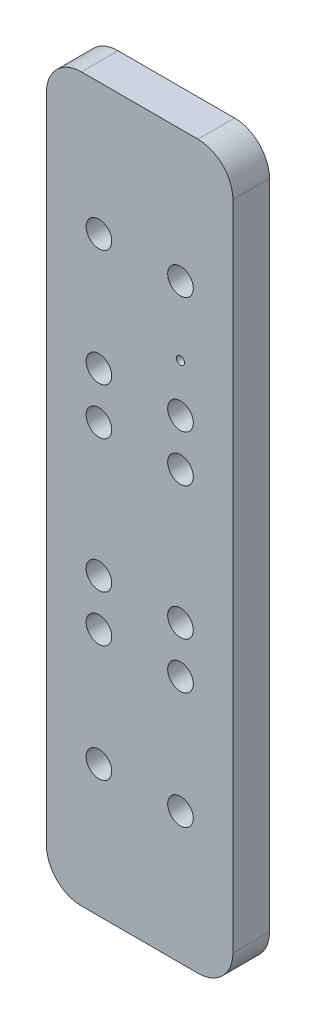
ISO-10303-21;
HEADER;
FILE_DESCRIPTION(('STEP AP214'),'2;1');
FILE_NAME('part.step','',(''),(''),'','','');
FILE_SCHEMA(('AUTOMOTIVE_DESIGN { 1 0 10303 214 1 1 1 1 }'));
ENDSEC;
DATA;
#1=APPLICATION_CONTEXT('core data for automotive mechanical design processes');
#2=APPLICATION_PROTOCOL_DEFINITION('international standard','automotive_design',2000,#1);
#3=PRODUCT_CONTEXT('',#1,'mechanical');
#4=PRODUCT('Part','Part','',(#3));
#5=PRODUCT_RELATED_PRODUCT_CATEGORY('part','',(#4));
#6=PRODUCT_DEFINITION_FORMATION('','',#4);
#7=PRODUCT_DEFINITION_CONTEXT('part definition',#1,'design');
#8=PRODUCT_DEFINITION('design','',#6,#7);
#9=PRODUCT_DEFINITION_SHAPE('','',#8);
#10=(LENGTH_UNIT() NAMED_UNIT(*) SI_UNIT(.MILLI.,.METRE.));
#11=(NAMED_UNIT(*) PLANE_ANGLE_UNIT() SI_UNIT($,.RADIAN.));
#12=(NAMED_UNIT(*) SI_UNIT($,.STERADIAN.) SOLID_ANGLE_UNIT());
#13=UNCERTAINTY_MEASURE_WITH_UNIT(LENGTH_MEASURE(1.E-05),#10,'distance_accuracy_value','');
#14=(GEOMETRIC_REPRESENTATION_CONTEXT(3) GLOBAL_UNCERTAINTY_ASSIGNED_CONTEXT((#13)) GLOBAL_UNIT_ASSIGNED_CONTEXT((#10,
#11,#12)) REPRESENTATION_CONTEXT('',''));
#15=CARTESIAN_POINT('',(0.,0.,0.));
#16=DIRECTION('',(0.,0.,1.));
#17=DIRECTION('',(1.,0.,0.));
#18=AXIS2_PLACEMENT_3D('',#15,#16,#17);
#19=CARTESIAN_POINT('',(4.,15.5,1.57));
#20=DIRECTION('',(0.,0.,1.));
#21=DIRECTION('',(1.,0.,0.));
#22=AXIS2_PLACEMENT_3D('',#19,#20,#21);
#23=PLANE('',#22);
#24=CARTESIAN_POINT('',(2.25,10.65,1.57));
#25=DIRECTION('',(0.,0.,1.));
#26=DIRECTION('',(1.,0.,0.));
#27=AXIS2_PLACEMENT_3D('',#24,#25,#26);
#28=CIRCLE('',#27,0.55);
#29=CARTESIAN_POINT('',(2.8,10.65,1.57));
#30=VERTEX_POINT('',#29);
#31=EDGE_CURVE('E165',#30,#30,#28,.F.);
#32=ORIENTED_EDGE('',*,*,#31,.T.);
#33=EDGE_LOOP('',(#32));
#34=FACE_BOUND('',#33,.T.);
#35=CARTESIAN_POINT('',(2.25,12.65,1.57));
#36=DIRECTION('',(0.,0.,1.));
#37=DIRECTION('',(1.,0.,0.));
#38=AXIS2_PLACEMENT_3D('',#35,#36,#37);
#39=CIRCLE('',#38,0.55);
#40=CARTESIAN_POINT('',(2.8,12.65,1.57));
#41=VERTEX_POINT('',#40);
#42=EDGE_CURVE('E168',#41,#41,#39,.F.);
#43=ORIENTED_EDGE('',*,*,#42,.T.);
#44=EDGE_LOOP('',(#43));
#45=FACE_BOUND('',#44,.T.);
#46=CARTESIAN_POINT('',(5.75,5.65,1.57));
#47=DIRECTION('',(0.,0.,1.));
#48=DIRECTION('',(1.,0.,0.));
#49=AXIS2_PLACEMENT_3D('',#46,#47,#48);
#50=CIRCLE('',#49,0.55);
#51=CARTESIAN_POINT('',(6.3,5.65,1.57));
#52=VERTEX_POINT('',#51);
#53=EDGE_CURVE('E171',#52,#52,#50,.F.);
#54=ORIENTED_EDGE('',*,*,#53,.T.);
#55=EDGE_LOOP('',(#54));
#56=FACE_BOUND('',#55,.T.);
#57=CARTESIAN_POINT('',(5.75,22.4,1.57));
#58=DIRECTION('',(0.,0.,1.));
#59=DIRECTION('',(1.,0.,0.));
#60=AXIS2_PLACEMENT_3D('',#57,#58,#59);
#61=CIRCLE('',#60,0.175000000000001);
#62=CARTESIAN_POINT('',(5.925,22.4,1.57));
#63=VERTEX_POINT('',#62);
#64=EDGE_CURVE('E174',#63,#63,#61,.F.);
#65=ORIENTED_EDGE('',*,*,#64,.T.);
#66=EDGE_LOOP('',(#65));
#67=FACE_BOUND('',#66,.T.);
#68=CARTESIAN_POINT('',(2.25,20.35,1.57));
#69=DIRECTION('',(0.,0.,1.));
#70=DIRECTION('',(1.,0.,0.));
#71=AXIS2_PLACEMENT_3D('',#68,#69,#70);
#72=CIRCLE('',#71,0.55);
#73=CARTESIAN_POINT('',(2.8,20.35,1.57));
#74=VERTEX_POINT('',#73);
#75=EDGE_CURVE('E177',#74,#74,#72,.F.);
#76=ORIENTED_EDGE('',*,*,#75,.T.);
#77=EDGE_LOOP('',(#76));
#78=FACE_BOUND('',#77,.T.);
#79=CARTESIAN_POINT('',(2.25,18.35,1.57));
#80=DIRECTION('',(0.,0.,1.));
#81=DIRECTION('',(1.,0.,0.));
#82=AXIS2_PLACEMENT_3D('',#79,#80,#81);
#83=CIRCLE('',#82,0.55);
#84=CARTESIAN_POINT('',(2.8,18.35,1.57));
#85=VERTEX_POINT('',#84);
#86=EDGE_CURVE('E180',#85,#85,#83,.F.);
#87=ORIENTED_EDGE('',*,*,#86,.T.);
#88=EDGE_LOOP('',(#87));
#89=FACE_BOUND('',#88,.T.);
#90=CARTESIAN_POINT('',(5.75,25.35,1.57));
#91=DIRECTION('',(0.,0.,1.));
#92=DIRECTION('',(1.,0.,0.));
#93=AXIS2_PLACEMENT_3D('',#90,#91,#92);
#94=CIRCLE('',#93,0.55);
#95=CARTESIAN_POINT('',(6.3,25.35,1.57));
#96=VERTEX_POINT('',#95);
#97=EDGE_CURVE('E183',#96,#96,#94,.F.);
#98=ORIENTED_EDGE('',*,*,#97,.T.);
#99=EDGE_LOOP('',(#98));
#100=FACE_BOUND('',#99,.T.);
#101=CARTESIAN_POINT('',(2.25,25.35,1.57));
#102=DIRECTION('',(0.,0.,1.));
#103=DIRECTION('',(1.,0.,0.));
#104=AXIS2_PLACEMENT_3D('',#101,#102,#103);
#105=CIRCLE('',#104,0.55);
#106=CARTESIAN_POINT('',(2.8,25.35,1.57));
#107=VERTEX_POINT('',#106);
#108=EDGE_CURVE('E186',#107,#107,#105,.F.);
#109=ORIENTED_EDGE('',*,*,#108,.T.);
#110=EDGE_LOOP('',(#109));
#111=FACE_BOUND('',#110,.T.);
#112=CARTESIAN_POINT('',(5.75,18.35,1.57));
#113=DIRECTION('',(0.,0.,1.));
#114=DIRECTION('',(1.,0.,0.));
#115=AXIS2_PLACEMENT_3D('',#112,#113,#114);
#116=CIRCLE('',#115,0.55);
#117=CARTESIAN_POINT('',(6.3,18.35,1.57));
#118=VERTEX_POINT('',#117);
#119=EDGE_CURVE('E189',#118,#118,#116,.F.);
#120=ORIENTED_EDGE('',*,*,#119,.T.);
#121=EDGE_LOOP('',(#120));
#122=FACE_BOUND('',#121,.T.);
#123=CARTESIAN_POINT('',(5.75,20.35,1.57));
#124=DIRECTION('',(0.,0.,1.));
#125=DIRECTION('',(1.,0.,0.));
#126=AXIS2_PLACEMENT_3D('',#123,#124,#125);
#127=CIRCLE('',#126,0.55);
#128=CARTESIAN_POINT('',(6.3,20.35,1.57));
#129=VERTEX_POINT('',#128);
#130=EDGE_CURVE('E192',#129,#129,#127,.F.);
#131=ORIENTED_EDGE('',*,*,#130,.T.);
#132=EDGE_LOOP('',(#131));
#133=FACE_BOUND('',#132,.T.);
#134=CARTESIAN_POINT('',(2.25,5.65,1.57));
#135=DIRECTION('',(0.,0.,1.));
#136=DIRECTION('',(1.,0.,0.));
#137=AXIS2_PLACEMENT_3D('',#134,#135,#136);
#138=CIRCLE('',#137,0.55);
#139=CARTESIAN_POINT('',(2.8,5.65,1.57));
#140=VERTEX_POINT('',#139);
#141=EDGE_CURVE('E195',#140,#140,#138,.F.);
#142=ORIENTED_EDGE('',*,*,#141,.T.);
#143=EDGE_LOOP('',(#142));
#144=FACE_BOUND('',#143,.T.);
#145=CARTESIAN_POINT('',(5.75,12.65,1.57));
#146=DIRECTION('',(0.,0.,1.));
#147=DIRECTION('',(1.,0.,0.));
#148=AXIS2_PLACEMENT_3D('',#145,#146,#147);
#149=CIRCLE('',#148,0.55);
#150=CARTESIAN_POINT('',(6.3,12.65,1.57));
#151=VERTEX_POINT('',#150);
#152=EDGE_CURVE('E198',#151,#151,#149,.F.);
#153=ORIENTED_EDGE('',*,*,#152,.T.);
#154=EDGE_LOOP('',(#153));
#155=FACE_BOUND('',#154,.T.);
#156=CARTESIAN_POINT('',(5.75,10.65,1.57));
#157=DIRECTION('',(0.,0.,1.));
#158=DIRECTION('',(1.,0.,0.));
#159=AXIS2_PLACEMENT_3D('',#156,#157,#158);
#160=CIRCLE('',#159,0.55);
#161=CARTESIAN_POINT('',(6.3,10.65,1.57));
#162=VERTEX_POINT('',#161);
#163=EDGE_CURVE('E201',#162,#162,#160,.F.);
#164=ORIENTED_EDGE('',*,*,#163,.T.);
#165=EDGE_LOOP('',(#164));
#166=FACE_BOUND('',#165,.T.);
#167=CARTESIAN_POINT('',(1.5,29.5,1.57));
#168=DIRECTION('',(0.,0.,1.));
#169=DIRECTION('',(1.,0.,0.));
#170=AXIS2_PLACEMENT_3D('',#167,#168,#169);
#171=CIRCLE('',#170,1.5);
#172=CARTESIAN_POINT('',(0.,29.5,1.57));
#173=VERTEX_POINT('',#172);
#174=CARTESIAN_POINT('',(1.5,31.,1.57));
#175=VERTEX_POINT('',#174);
#176=EDGE_CURVE('E206',#173,#175,#171,.F.);
#177=ORIENTED_EDGE('',*,*,#176,.F.);
#178=DIRECTION('',(0.,1.,0.));
#179=VECTOR('',#178,1.);
#180=CARTESIAN_POINT('',(0.,29.5,1.57));
#181=LINE('',#180,#179);
#182=CARTESIAN_POINT('',(0.,1.5,1.57));
#183=VERTEX_POINT('',#182);
#184=EDGE_CURVE('E109',#183,#173,#181,.T.);
#185=ORIENTED_EDGE('',*,*,#184,.F.);
#186=CARTESIAN_POINT('',(1.5,1.5,1.57));
#187=DIRECTION('',(0.,0.,1.));
#188=DIRECTION('',(1.,0.,0.));
#189=AXIS2_PLACEMENT_3D('',#186,#187,#188);
#190=CIRCLE('',#189,1.5);
#191=CARTESIAN_POINT('',(1.5,0.,1.57));
#192=VERTEX_POINT('',#191);
#193=EDGE_CURVE('E96',#192,#183,#190,.F.);
#194=ORIENTED_EDGE('',*,*,#193,.F.);
#195=DIRECTION('',(1.,0.,0.));
#196=VECTOR('',#195,1.);
#197=CARTESIAN_POINT('',(1.5,0.,1.57));
#198=LINE('',#197,#196);
#199=CARTESIAN_POINT('',(6.5,0.,1.57));
#200=VERTEX_POINT('',#199);
#201=EDGE_CURVE('E92',#200,#192,#198,.F.);
#202=ORIENTED_EDGE('',*,*,#201,.F.);
#203=CARTESIAN_POINT('',(6.5,1.5,1.57));
#204=DIRECTION('',(0.,0.,1.));
#205=DIRECTION('',(1.,0.,0.));
#206=AXIS2_PLACEMENT_3D('',#203,#204,#205);
#207=CIRCLE('',#206,1.5);
#208=CARTESIAN_POINT('',(8.,1.5,1.57));
#209=VERTEX_POINT('',#208);
#210=EDGE_CURVE('E20',#209,#200,#207,.F.);
#211=ORIENTED_EDGE('',*,*,#210,.F.);
#212=DIRECTION('',(0.,1.,0.));
#213=VECTOR('',#212,1.);
#214=CARTESIAN_POINT('',(8.,1.5,1.57));
#215=LINE('',#214,#213);
#216=CARTESIAN_POINT('',(8.,29.5,1.57));
#217=VERTEX_POINT('',#216);
#218=EDGE_CURVE('E79',#217,#209,#215,.F.);
#219=ORIENTED_EDGE('',*,*,#218,.F.);
#220=CARTESIAN_POINT('',(6.5,29.5,1.57));
#221=DIRECTION('',(0.,0.,1.));
#222=DIRECTION('',(1.,0.,0.));
#223=AXIS2_PLACEMENT_3D('',#220,#221,#222);
#224=CIRCLE('',#223,1.5);
#225=CARTESIAN_POINT('',(6.5,31.,1.57));
#226=VERTEX_POINT('',#225);
#227=EDGE_CURVE('E207',#226,#217,#224,.F.);
#228=ORIENTED_EDGE('',*,*,#227,.F.);
#229=DIRECTION('',(1.,0.,0.));
#230=VECTOR('',#229,1.);
#231=CARTESIAN_POINT('',(6.5,31.,1.57));
#232=LINE('',#231,#230);
#233=EDGE_CURVE('E113',#175,#226,#232,.T.);
#234=ORIENTED_EDGE('',*,*,#233,.F.);
#235=EDGE_LOOP('',(#177,#185,#194,#202,#211,#219,#228,#234));
#236=FACE_BOUND('',#235,.T.);
#237=ADVANCED_FACE('F17',(#34,#45,#56,#67,#78,#89,#100,#111,#122,#133,#144,#155,#166,#236),#23,.T.);
#238=CARTESIAN_POINT('',(1.5,0.,0.));
#239=DIRECTION('',(0.,-1.,0.));
#240=DIRECTION('',(0.,0.,-1.));
#241=AXIS2_PLACEMENT_3D('',#238,#239,#240);
#242=PLANE('',#241);
#243=ORIENTED_EDGE('',*,*,#201,.T.);
#244=DIRECTION('',(0.,0.,1.));
#245=VECTOR('',#244,1.);
#246=CARTESIAN_POINT('',(1.5,0.,0.));
#247=LINE('',#246,#245);
#248=CARTESIAN_POINT('',(1.5,0.,0.));
#249=VERTEX_POINT('',#248);
#250=EDGE_CURVE('E205',#249,#192,#247,.T.);
#251=ORIENTED_EDGE('',*,*,#250,.F.);
#252=DIRECTION('',(1.,0.,0.));
#253=VECTOR('',#252,1.);
#254=CARTESIAN_POINT('',(4.,0.,0.));
#255=LINE('',#254,#253);
#256=CARTESIAN_POINT('',(6.5,0.,0.));
#257=VERTEX_POINT('',#256);
#258=EDGE_CURVE('E103',#249,#257,#255,.T.);
#259=ORIENTED_EDGE('',*,*,#258,.T.);
#260=DIRECTION('',(0.,0.,1.));
#261=VECTOR('',#260,1.);
#262=CARTESIAN_POINT('',(6.5,0.,0.));
#263=LINE('',#262,#261);
#264=EDGE_CURVE('E88',#200,#257,#263,.F.);
#265=ORIENTED_EDGE('',*,*,#264,.F.);
#266=EDGE_LOOP('',(#243,#251,#259,#265));
#267=FACE_BOUND('',#266,.T.);
#268=ADVANCED_FACE('F102',(#267),#242,.T.);
#269=CARTESIAN_POINT('',(6.5,1.5,0.));
#270=DIRECTION('',(0.,0.,1.));
#271=DIRECTION('',(1.,0.,0.));
#272=AXIS2_PLACEMENT_3D('',#269,#270,#271);
#273=CYLINDRICAL_SURFACE('',#272,1.5);
#274=ORIENTED_EDGE('',*,*,#210,.T.);
#275=ORIENTED_EDGE('',*,*,#264,.T.);
#276=CARTESIAN_POINT('',(6.5,1.5,0.));
#277=DIRECTION('',(0.,0.,1.));
#278=DIRECTION('',(1.,0.,0.));
#279=AXIS2_PLACEMENT_3D('',#276,#277,#278);
#280=CIRCLE('',#279,1.5);
#281=CARTESIAN_POINT('',(8.,1.5,0.));
#282=VERTEX_POINT('',#281);
#283=EDGE_CURVE('E163',#257,#282,#280,.T.);
#284=ORIENTED_EDGE('',*,*,#283,.T.);
#285=DIRECTION('',(0.,0.,-1.));
#286=VECTOR('',#285,1.);
#287=CARTESIAN_POINT('',(8.,1.5,0.));
#288=LINE('',#287,#286);
#289=EDGE_CURVE('E90',#209,#282,#288,.T.);
#290=ORIENTED_EDGE('',*,*,#289,.F.);
#291=EDGE_LOOP('',(#274,#275,#284,#290));
#292=FACE_BOUND('',#291,.T.);
#293=ADVANCED_FACE('F85',(#292),#273,.T.);
#294=CARTESIAN_POINT('',(8.,1.5,0.));
#295=DIRECTION('',(1.,0.,0.));
#296=DIRECTION('',(0.,0.,-1.));
#297=AXIS2_PLACEMENT_3D('',#294,#295,#296);
#298=PLANE('',#297);
#299=ORIENTED_EDGE('',*,*,#218,.T.);
#300=ORIENTED_EDGE('',*,*,#289,.T.);
#301=DIRECTION('',(0.,1.,0.));
#302=VECTOR('',#301,1.);
#303=CARTESIAN_POINT('',(8.,15.5,0.));
#304=LINE('',#303,#302);
#305=CARTESIAN_POINT('',(8.,29.5,0.));
#306=VERTEX_POINT('',#305);
#307=EDGE_CURVE('E162',#282,#306,#304,.T.);
#308=ORIENTED_EDGE('',*,*,#307,.T.);
#309=DIRECTION('',(0.,0.,1.));
#310=VECTOR('',#309,1.);
#311=CARTESIAN_POINT('',(8.,29.5,0.));
#312=LINE('',#311,#310);
#313=EDGE_CURVE('E115',#217,#306,#312,.F.);
#314=ORIENTED_EDGE('',*,*,#313,.F.);
#315=EDGE_LOOP('',(#299,#300,#308,#314));
#316=FACE_BOUND('',#315,.T.);
#317=ADVANCED_FACE('F213',(#316),#298,.T.);
#318=CARTESIAN_POINT('',(6.5,29.5,0.));
#319=DIRECTION('',(0.,0.,1.));
#320=DIRECTION('',(1.,0.,0.));
#321=AXIS2_PLACEMENT_3D('',#318,#319,#320);
#322=CYLINDRICAL_SURFACE('',#321,1.5);
#323=ORIENTED_EDGE('',*,*,#227,.T.);
#324=ORIENTED_EDGE('',*,*,#313,.T.);
#325=CARTESIAN_POINT('',(6.5,29.5,0.));
#326=DIRECTION('',(0.,0.,1.));
#327=DIRECTION('',(1.,0.,0.));
#328=AXIS2_PLACEMENT_3D('',#325,#326,#327);
#329=CIRCLE('',#328,1.5);
#330=CARTESIAN_POINT('',(6.5,31.,0.));
#331=VERTEX_POINT('',#330);
#332=EDGE_CURVE('E159',#306,#331,#329,.T.);
#333=ORIENTED_EDGE('',*,*,#332,.T.);
#334=DIRECTION('',(0.,0.,1.));
#335=VECTOR('',#334,1.);
#336=CARTESIAN_POINT('',(6.5,31.,0.));
#337=LINE('',#336,#335);
#338=EDGE_CURVE('E114',#226,#331,#337,.F.);
#339=ORIENTED_EDGE('',*,*,#338,.F.);
#340=EDGE_LOOP('',(#323,#324,#333,#339));
#341=FACE_BOUND('',#340,.T.);
#342=ADVANCED_FACE('F234',(#341),#322,.T.);
#343=CARTESIAN_POINT('',(6.5,31.,0.));
#344=DIRECTION('',(0.,1.,0.));
#345=DIRECTION('',(0.,0.,1.));
#346=AXIS2_PLACEMENT_3D('',#343,#344,#345);
#347=PLANE('',#346);
#348=ORIENTED_EDGE('',*,*,#233,.T.);
#349=ORIENTED_EDGE('',*,*,#338,.T.);
#350=DIRECTION('',(1.,0.,0.));
#351=VECTOR('',#350,1.);
#352=CARTESIAN_POINT('',(4.,31.,0.));
#353=LINE('',#352,#351);
#354=CARTESIAN_POINT('',(1.5,31.,0.));
#355=VERTEX_POINT('',#354);
#356=EDGE_CURVE('E158',#331,#355,#353,.F.);
#357=ORIENTED_EDGE('',*,*,#356,.T.);
#358=DIRECTION('',(0.,0.,1.));
#359=VECTOR('',#358,1.);
#360=CARTESIAN_POINT('',(1.5,31.,0.));
#361=LINE('',#360,#359);
#362=EDGE_CURVE('E111',#175,#355,#361,.F.);
#363=ORIENTED_EDGE('',*,*,#362,.F.);
#364=EDGE_LOOP('',(#348,#349,#357,#363));
#365=FACE_BOUND('',#364,.T.);
#366=ADVANCED_FACE('F230',(#365),#347,.T.);
#367=CARTESIAN_POINT('',(1.5,29.5,0.));
#368=DIRECTION('',(0.,0.,1.));
#369=DIRECTION('',(1.,0.,0.));
#370=AXIS2_PLACEMENT_3D('',#367,#368,#369);
#371=CYLINDRICAL_SURFACE('',#370,1.5);
#372=ORIENTED_EDGE('',*,*,#176,.T.);
#373=ORIENTED_EDGE('',*,*,#362,.T.);
#374=CARTESIAN_POINT('',(1.5,29.5,0.));
#375=DIRECTION('',(0.,0.,1.));
#376=DIRECTION('',(1.,0.,0.));
#377=AXIS2_PLACEMENT_3D('',#374,#375,#376);
#378=CIRCLE('',#377,1.5);
#379=CARTESIAN_POINT('',(0.,29.5,0.));
#380=VERTEX_POINT('',#379);
#381=EDGE_CURVE('E155',#355,#380,#378,.T.);
#382=ORIENTED_EDGE('',*,*,#381,.T.);
#383=DIRECTION('',(0.,0.,1.));
#384=VECTOR('',#383,1.);
#385=CARTESIAN_POINT('',(0.,29.5,0.));
#386=LINE('',#385,#384);
#387=EDGE_CURVE('E110',#173,#380,#386,.F.);
#388=ORIENTED_EDGE('',*,*,#387,.F.);
#389=EDGE_LOOP('',(#372,#373,#382,#388));
#390=FACE_BOUND('',#389,.T.);
#391=ADVANCED_FACE('F242',(#390),#371,.T.);
#392=CARTESIAN_POINT('',(0.,29.5,0.));
#393=DIRECTION('',(-1.,0.,0.));
#394=DIRECTION('',(0.,0.,1.));
#395=AXIS2_PLACEMENT_3D('',#392,#393,#394);
#396=PLANE('',#395);
#397=ORIENTED_EDGE('',*,*,#184,.T.);
#398=ORIENTED_EDGE('',*,*,#387,.T.);
#399=DIRECTION('',(0.,1.,0.));
#400=VECTOR('',#399,1.);
#401=CARTESIAN_POINT('',(0.,15.5,0.));
#402=LINE('',#401,#400);
#403=CARTESIAN_POINT('',(0.,1.5,0.));
#404=VERTEX_POINT('',#403);
#405=EDGE_CURVE('E154',#380,#404,#402,.F.);
#406=ORIENTED_EDGE('',*,*,#405,.T.);
#407=DIRECTION('',(0.,0.,1.));
#408=VECTOR('',#407,1.);
#409=CARTESIAN_POINT('',(0.,1.5,0.));
#410=LINE('',#409,#408);
#411=EDGE_CURVE('E35',#183,#404,#410,.F.);
#412=ORIENTED_EDGE('',*,*,#411,.F.);
#413=EDGE_LOOP('',(#397,#398,#406,#412));
#414=FACE_BOUND('',#413,.T.);
#415=ADVANCED_FACE('F308',(#414),#396,.T.);
#416=CARTESIAN_POINT('',(1.5,1.5,0.));
#417=DIRECTION('',(0.,0.,1.));
#418=DIRECTION('',(1.,0.,0.));
#419=AXIS2_PLACEMENT_3D('',#416,#417,#418);
#420=CYLINDRICAL_SURFACE('',#419,1.5);
#421=ORIENTED_EDGE('',*,*,#193,.T.);
#422=ORIENTED_EDGE('',*,*,#411,.T.);
#423=CARTESIAN_POINT('',(1.5,1.5,0.));
#424=DIRECTION('',(0.,0.,1.));
#425=DIRECTION('',(1.,0.,0.));
#426=AXIS2_PLACEMENT_3D('',#423,#424,#425);
#427=CIRCLE('',#426,1.5);
#428=EDGE_CURVE('E152',#404,#249,#427,.T.);
#429=ORIENTED_EDGE('',*,*,#428,.T.);
#430=ORIENTED_EDGE('',*,*,#250,.T.);
#431=EDGE_LOOP('',(#421,#422,#429,#430));
#432=FACE_BOUND('',#431,.T.);
#433=ADVANCED_FACE('F304',(#432),#420,.T.);
#434=CARTESIAN_POINT('',(5.75,10.65,0.));
#435=DIRECTION('',(0.,0.,1.));
#436=DIRECTION('',(1.,0.,0.));
#437=AXIS2_PLACEMENT_3D('',#434,#435,#436);
#438=CYLINDRICAL_SURFACE('',#437,0.55);
#439=ORIENTED_EDGE('',*,*,#163,.F.);
#440=EDGE_LOOP('',(#439));
#441=FACE_BOUND('',#440,.T.);
#442=CARTESIAN_POINT('',(5.75,10.65,0.));
#443=DIRECTION('',(0.,0.,1.));
#444=DIRECTION('',(1.,0.,0.));
#445=AXIS2_PLACEMENT_3D('',#442,#443,#444);
#446=CIRCLE('',#445,0.55);
#447=CARTESIAN_POINT('',(6.3,10.65,0.));
#448=VERTEX_POINT('',#447);
#449=EDGE_CURVE('E149',#448,#448,#446,.F.);
#450=ORIENTED_EDGE('',*,*,#449,.T.);
#451=EDGE_LOOP('',(#450));
#452=FACE_BOUND('',#451,.T.);
#453=ADVANCED_FACE('F300',(#441,#452),#438,.F.);
#454=CARTESIAN_POINT('',(5.75,12.65,0.));
#455=DIRECTION('',(0.,0.,1.));
#456=DIRECTION('',(1.,0.,0.));
#457=AXIS2_PLACEMENT_3D('',#454,#455,#456);
#458=CYLINDRICAL_SURFACE('',#457,0.55);
#459=ORIENTED_EDGE('',*,*,#152,.F.);
#460=EDGE_LOOP('',(#459));
#461=FACE_BOUND('',#460,.T.);
#462=CARTESIAN_POINT('',(5.75,12.65,0.));
#463=DIRECTION('',(0.,0.,1.));
#464=DIRECTION('',(1.,0.,0.));
#465=AXIS2_PLACEMENT_3D('',#462,#463,#464);
#466=CIRCLE('',#465,0.55);
#467=CARTESIAN_POINT('',(6.3,12.65,0.));
#468=VERTEX_POINT('',#467);
#469=EDGE_CURVE('E146',#468,#468,#466,.F.);
#470=ORIENTED_EDGE('',*,*,#469,.T.);
#471=EDGE_LOOP('',(#470));
#472=FACE_BOUND('',#471,.T.);
#473=ADVANCED_FACE('F296',(#461,#472),#458,.F.);
#474=CARTESIAN_POINT('',(2.25,5.65,0.));
#475=DIRECTION('',(0.,0.,1.));
#476=DIRECTION('',(1.,0.,0.));
#477=AXIS2_PLACEMENT_3D('',#474,#475,#476);
#478=CYLINDRICAL_SURFACE('',#477,0.55);
#479=ORIENTED_EDGE('',*,*,#141,.F.);
#480=EDGE_LOOP('',(#479));
#481=FACE_BOUND('',#480,.T.);
#482=CARTESIAN_POINT('',(2.25,5.65,0.));
#483=DIRECTION('',(0.,0.,1.));
#484=DIRECTION('',(1.,0.,0.));
#485=AXIS2_PLACEMENT_3D('',#482,#483,#484);
#486=CIRCLE('',#485,0.55);
#487=CARTESIAN_POINT('',(2.8,5.65,0.));
#488=VERTEX_POINT('',#487);
#489=EDGE_CURVE('E143',#488,#488,#486,.F.);
#490=ORIENTED_EDGE('',*,*,#489,.T.);
#491=EDGE_LOOP('',(#490));
#492=FACE_BOUND('',#491,.T.);
#493=ADVANCED_FACE('F292',(#481,#492),#478,.F.);
#494=CARTESIAN_POINT('',(5.75,20.35,0.));
#495=DIRECTION('',(0.,0.,1.));
#496=DIRECTION('',(1.,0.,0.));
#497=AXIS2_PLACEMENT_3D('',#494,#495,#496);
#498=CYLINDRICAL_SURFACE('',#497,0.55);
#499=ORIENTED_EDGE('',*,*,#130,.F.);
#500=EDGE_LOOP('',(#499));
#501=FACE_BOUND('',#500,.T.);
#502=CARTESIAN_POINT('',(5.75,20.35,0.));
#503=DIRECTION('',(0.,0.,1.));
#504=DIRECTION('',(1.,0.,0.));
#505=AXIS2_PLACEMENT_3D('',#502,#503,#504);
#506=CIRCLE('',#505,0.55);
#507=CARTESIAN_POINT('',(6.3,20.35,0.));
#508=VERTEX_POINT('',#507);
#509=EDGE_CURVE('E140',#508,#508,#506,.F.);
#510=ORIENTED_EDGE('',*,*,#509,.T.);
#511=EDGE_LOOP('',(#510));
#512=FACE_BOUND('',#511,.T.);
#513=ADVANCED_FACE('F288',(#501,#512),#498,.F.);
#514=CARTESIAN_POINT('',(5.75,18.35,0.));
#515=DIRECTION('',(0.,0.,1.));
#516=DIRECTION('',(1.,0.,0.));
#517=AXIS2_PLACEMENT_3D('',#514,#515,#516);
#518=CYLINDRICAL_SURFACE('',#517,0.55);
#519=ORIENTED_EDGE('',*,*,#119,.F.);
#520=EDGE_LOOP('',(#519));
#521=FACE_BOUND('',#520,.T.);
#522=CARTESIAN_POINT('',(5.75,18.35,0.));
#523=DIRECTION('',(0.,0.,1.));
#524=DIRECTION('',(1.,0.,0.));
#525=AXIS2_PLACEMENT_3D('',#522,#523,#524);
#526=CIRCLE('',#525,0.55);
#527=CARTESIAN_POINT('',(6.3,18.35,0.));
#528=VERTEX_POINT('',#527);
#529=EDGE_CURVE('E137',#528,#528,#526,.F.);
#530=ORIENTED_EDGE('',*,*,#529,.T.);
#531=EDGE_LOOP('',(#530));
#532=FACE_BOUND('',#531,.T.);
#533=ADVANCED_FACE('F284',(#521,#532),#518,.F.);
#534=CARTESIAN_POINT('',(2.25,25.35,0.));
#535=DIRECTION('',(0.,0.,1.));
#536=DIRECTION('',(1.,0.,0.));
#537=AXIS2_PLACEMENT_3D('',#534,#535,#536);
#538=CYLINDRICAL_SURFACE('',#537,0.55);
#539=ORIENTED_EDGE('',*,*,#108,.F.);
#540=EDGE_LOOP('',(#539));
#541=FACE_BOUND('',#540,.T.);
#542=CARTESIAN_POINT('',(2.25,25.35,0.));
#543=DIRECTION('',(0.,0.,1.));
#544=DIRECTION('',(1.,0.,0.));
#545=AXIS2_PLACEMENT_3D('',#542,#543,#544);
#546=CIRCLE('',#545,0.55);
#547=CARTESIAN_POINT('',(2.8,25.35,0.));
#548=VERTEX_POINT('',#547);
#549=EDGE_CURVE('E134',#548,#548,#546,.F.);
#550=ORIENTED_EDGE('',*,*,#549,.T.);
#551=EDGE_LOOP('',(#550));
#552=FACE_BOUND('',#551,.T.);
#553=ADVANCED_FACE('F280',(#541,#552),#538,.F.);
#554=CARTESIAN_POINT('',(5.75,25.35,0.));
#555=DIRECTION('',(0.,0.,1.));
#556=DIRECTION('',(1.,0.,0.));
#557=AXIS2_PLACEMENT_3D('',#554,#555,#556);
#558=CYLINDRICAL_SURFACE('',#557,0.55);
#559=ORIENTED_EDGE('',*,*,#97,.F.);
#560=EDGE_LOOP('',(#559));
#561=FACE_BOUND('',#560,.T.);
#562=CARTESIAN_POINT('',(5.75,25.35,0.));
#563=DIRECTION('',(0.,0.,1.));
#564=DIRECTION('',(1.,0.,0.));
#565=AXIS2_PLACEMENT_3D('',#562,#563,#564);
#566=CIRCLE('',#565,0.55);
#567=CARTESIAN_POINT('',(6.3,25.35,0.));
#568=VERTEX_POINT('',#567);
#569=EDGE_CURVE('E131',#568,#568,#566,.F.);
#570=ORIENTED_EDGE('',*,*,#569,.T.);
#571=EDGE_LOOP('',(#570));
#572=FACE_BOUND('',#571,.T.);
#573=ADVANCED_FACE('F276',(#561,#572),#558,.F.);
#574=CARTESIAN_POINT('',(2.25,18.35,0.));
#575=DIRECTION('',(0.,0.,1.));
#576=DIRECTION('',(1.,0.,0.));
#577=AXIS2_PLACEMENT_3D('',#574,#575,#576);
#578=CYLINDRICAL_SURFACE('',#577,0.55);
#579=ORIENTED_EDGE('',*,*,#86,.F.);
#580=EDGE_LOOP('',(#579));
#581=FACE_BOUND('',#580,.T.);
#582=CARTESIAN_POINT('',(2.25,18.35,0.));
#583=DIRECTION('',(0.,0.,1.));
#584=DIRECTION('',(1.,0.,0.));
#585=AXIS2_PLACEMENT_3D('',#582,#583,#584);
#586=CIRCLE('',#585,0.55);
#587=CARTESIAN_POINT('',(2.8,18.35,0.));
#588=VERTEX_POINT('',#587);
#589=EDGE_CURVE('E128',#588,#588,#586,.F.);
#590=ORIENTED_EDGE('',*,*,#589,.T.);
#591=EDGE_LOOP('',(#590));
#592=FACE_BOUND('',#591,.T.);
#593=ADVANCED_FACE('F272',(#581,#592),#578,.F.);
#594=CARTESIAN_POINT('',(2.25,20.35,0.));
#595=DIRECTION('',(0.,0.,1.));
#596=DIRECTION('',(1.,0.,0.));
#597=AXIS2_PLACEMENT_3D('',#594,#595,#596);
#598=CYLINDRICAL_SURFACE('',#597,0.55);
#599=ORIENTED_EDGE('',*,*,#75,.F.);
#600=EDGE_LOOP('',(#599));
#601=FACE_BOUND('',#600,.T.);
#602=CARTESIAN_POINT('',(2.25,20.35,0.));
#603=DIRECTION('',(0.,0.,1.));
#604=DIRECTION('',(1.,0.,0.));
#605=AXIS2_PLACEMENT_3D('',#602,#603,#604);
#606=CIRCLE('',#605,0.55);
#607=CARTESIAN_POINT('',(2.8,20.35,0.));
#608=VERTEX_POINT('',#607);
#609=EDGE_CURVE('E125',#608,#608,#606,.F.);
#610=ORIENTED_EDGE('',*,*,#609,.T.);
#611=EDGE_LOOP('',(#610));
#612=FACE_BOUND('',#611,.T.);
#613=ADVANCED_FACE('F268',(#601,#612),#598,.F.);
#614=CARTESIAN_POINT('',(5.75,22.4,0.));
#615=DIRECTION('',(0.,0.,1.));
#616=DIRECTION('',(1.,0.,0.));
#617=AXIS2_PLACEMENT_3D('',#614,#615,#616);
#618=CYLINDRICAL_SURFACE('',#617,0.175000000000001);
#619=ORIENTED_EDGE('',*,*,#64,.F.);
#620=EDGE_LOOP('',(#619));
#621=FACE_BOUND('',#620,.T.);
#622=CARTESIAN_POINT('',(5.75,22.4,0.));
#623=DIRECTION('',(0.,0.,1.));
#624=DIRECTION('',(1.,0.,0.));
#625=AXIS2_PLACEMENT_3D('',#622,#623,#624);
#626=CIRCLE('',#625,0.175000000000001);
#627=CARTESIAN_POINT('',(5.925,22.4,0.));
#628=VERTEX_POINT('',#627);
#629=EDGE_CURVE('E122',#628,#628,#626,.F.);
#630=ORIENTED_EDGE('',*,*,#629,.T.);
#631=EDGE_LOOP('',(#630));
#632=FACE_BOUND('',#631,.T.);
#633=ADVANCED_FACE('F264',(#621,#632),#618,.F.);
#634=CARTESIAN_POINT('',(5.75,5.65,0.));
#635=DIRECTION('',(0.,0.,1.));
#636=DIRECTION('',(1.,0.,0.));
#637=AXIS2_PLACEMENT_3D('',#634,#635,#636);
#638=CYLINDRICAL_SURFACE('',#637,0.55);
#639=ORIENTED_EDGE('',*,*,#53,.F.);
#640=EDGE_LOOP('',(#639));
#641=FACE_BOUND('',#640,.T.);
#642=CARTESIAN_POINT('',(5.75,5.65,0.));
#643=DIRECTION('',(0.,0.,1.));
#644=DIRECTION('',(1.,0.,0.));
#645=AXIS2_PLACEMENT_3D('',#642,#643,#644);
#646=CIRCLE('',#645,0.55);
#647=CARTESIAN_POINT('',(6.3,5.65,0.));
#648=VERTEX_POINT('',#647);
#649=EDGE_CURVE('E119',#648,#648,#646,.F.);
#650=ORIENTED_EDGE('',*,*,#649,.T.);
#651=EDGE_LOOP('',(#650));
#652=FACE_BOUND('',#651,.T.);
#653=ADVANCED_FACE('F260',(#641,#652),#638,.F.);
#654=CARTESIAN_POINT('',(2.25,12.65,0.));
#655=DIRECTION('',(0.,0.,1.));
#656=DIRECTION('',(1.,0.,0.));
#657=AXIS2_PLACEMENT_3D('',#654,#655,#656);
#658=CYLINDRICAL_SURFACE('',#657,0.55);
#659=ORIENTED_EDGE('',*,*,#42,.F.);
#660=EDGE_LOOP('',(#659));
#661=FACE_BOUND('',#660,.T.);
#662=CARTESIAN_POINT('',(2.25,12.65,0.));
#663=DIRECTION('',(0.,0.,1.));
#664=DIRECTION('',(1.,0.,0.));
#665=AXIS2_PLACEMENT_3D('',#662,#663,#664);
#666=CIRCLE('',#665,0.55);
#667=CARTESIAN_POINT('',(2.8,12.65,0.));
#668=VERTEX_POINT('',#667);
#669=EDGE_CURVE('E26',#668,#668,#666,.F.);
#670=ORIENTED_EDGE('',*,*,#669,.T.);
#671=EDGE_LOOP('',(#670));
#672=FACE_BOUND('',#671,.T.);
#673=ADVANCED_FACE('F252',(#661,#672),#658,.F.);
#674=CARTESIAN_POINT('',(2.25,10.65,0.));
#675=DIRECTION('',(0.,0.,1.));
#676=DIRECTION('',(1.,0.,0.));
#677=AXIS2_PLACEMENT_3D('',#674,#675,#676);
#678=CYLINDRICAL_SURFACE('',#677,0.55);
#679=ORIENTED_EDGE('',*,*,#31,.F.);
#680=EDGE_LOOP('',(#679));
#681=FACE_BOUND('',#680,.T.);
#682=CARTESIAN_POINT('',(2.25,10.65,0.));
#683=DIRECTION('',(0.,0.,1.));
#684=DIRECTION('',(1.,0.,0.));
#685=AXIS2_PLACEMENT_3D('',#682,#683,#684);
#686=CIRCLE('',#685,0.55);
#687=CARTESIAN_POINT('',(2.8,10.65,0.));
#688=VERTEX_POINT('',#687);
#689=EDGE_CURVE('E11',#688,#688,#686,.F.);
#690=ORIENTED_EDGE('',*,*,#689,.T.);
#691=EDGE_LOOP('',(#690));
#692=FACE_BOUND('',#691,.T.);
#693=ADVANCED_FACE('F246',(#681,#692),#678,.F.);
#694=CARTESIAN_POINT('',(4.,15.5,0.));
#695=DIRECTION('',(0.,0.,1.));
#696=DIRECTION('',(1.,0.,0.));
#697=AXIS2_PLACEMENT_3D('',#694,#695,#696);
#698=PLANE('',#697);
#699=ORIENTED_EDGE('',*,*,#689,.F.);
#700=EDGE_LOOP('',(#699));
#701=FACE_BOUND('',#700,.T.);
#702=ORIENTED_EDGE('',*,*,#669,.F.);
#703=EDGE_LOOP('',(#702));
#704=FACE_BOUND('',#703,.T.);
#705=ORIENTED_EDGE('',*,*,#649,.F.);
#706=EDGE_LOOP('',(#705));
#707=FACE_BOUND('',#706,.T.);
#708=ORIENTED_EDGE('',*,*,#629,.F.);
#709=EDGE_LOOP('',(#708));
#710=FACE_BOUND('',#709,.T.);
#711=ORIENTED_EDGE('',*,*,#609,.F.);
#712=EDGE_LOOP('',(#711));
#713=FACE_BOUND('',#712,.T.);
#714=ORIENTED_EDGE('',*,*,#589,.F.);
#715=EDGE_LOOP('',(#714));
#716=FACE_BOUND('',#715,.T.);
#717=ORIENTED_EDGE('',*,*,#569,.F.);
#718=EDGE_LOOP('',(#717));
#719=FACE_BOUND('',#718,.T.);
#720=ORIENTED_EDGE('',*,*,#549,.F.);
#721=EDGE_LOOP('',(#720));
#722=FACE_BOUND('',#721,.T.);
#723=ORIENTED_EDGE('',*,*,#529,.F.);
#724=EDGE_LOOP('',(#723));
#725=FACE_BOUND('',#724,.T.);
#726=ORIENTED_EDGE('',*,*,#509,.F.);
#727=EDGE_LOOP('',(#726));
#728=FACE_BOUND('',#727,.T.);
#729=ORIENTED_EDGE('',*,*,#489,.F.);
#730=EDGE_LOOP('',(#729));
#731=FACE_BOUND('',#730,.T.);
#732=ORIENTED_EDGE('',*,*,#469,.F.);
#733=EDGE_LOOP('',(#732));
#734=FACE_BOUND('',#733,.T.);
#735=ORIENTED_EDGE('',*,*,#449,.F.);
#736=EDGE_LOOP('',(#735));
#737=FACE_BOUND('',#736,.T.);
#738=ORIENTED_EDGE('',*,*,#405,.F.);
#739=ORIENTED_EDGE('',*,*,#381,.F.);
#740=ORIENTED_EDGE('',*,*,#356,.F.);
#741=ORIENTED_EDGE('',*,*,#332,.F.);
#742=ORIENTED_EDGE('',*,*,#307,.F.);
#743=ORIENTED_EDGE('',*,*,#283,.F.);
#744=ORIENTED_EDGE('',*,*,#258,.F.);
#745=ORIENTED_EDGE('',*,*,#428,.F.);
#746=EDGE_LOOP('',(#738,#739,#740,#741,#742,#743,#744,#745));
#747=FACE_BOUND('',#746,.T.);
#748=ADVANCED_FACE('F217',(#701,#704,#707,#710,#713,#716,#719,#722,#725,#728,#731,#734,#737,
#747),#698,.F.);
#749=CLOSED_SHELL('',(#237,#268,#293,#317,#342,#366,#391,#415,#433,#453,#473,#493,#513,#533,
#553,#573,#593,#613,#633,#653,#673,#693,#748));
#750=MANIFOLD_SOLID_BREP('B1',#749);
#751=ADVANCED_BREP_SHAPE_REPRESENTATION('',(#18,#750),#14);
#752=SHAPE_DEFINITION_REPRESENTATION(#9,#751);
ENDSEC;
END-ISO-10303-21;
